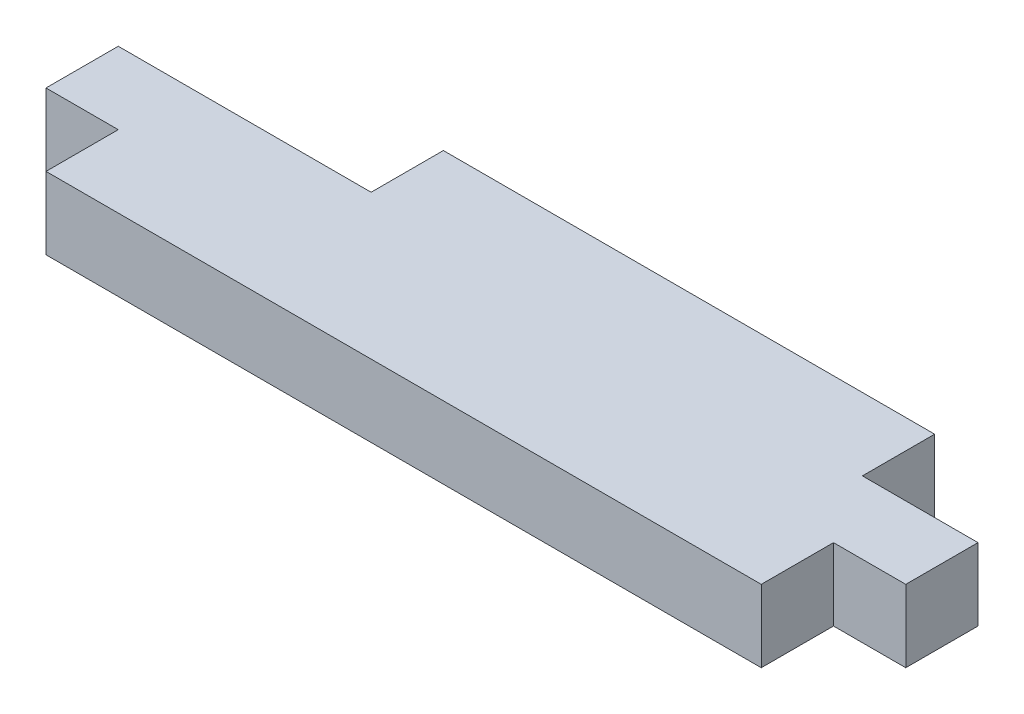
ISO-10303-21;
HEADER;
FILE_DESCRIPTION(('STEP AP214'),'2;1');
FILE_NAME('part.step','',(''),(''),'','','');
FILE_SCHEMA(('AUTOMOTIVE_DESIGN { 1 0 10303 214 1 1 1 1 }'));
ENDSEC;
DATA;
#1=APPLICATION_CONTEXT('core data for automotive mechanical design processes');
#2=APPLICATION_PROTOCOL_DEFINITION('international standard','automotive_design',2000,#1);
#3=PRODUCT_CONTEXT('',#1,'mechanical');
#4=PRODUCT('Part','Part','',(#3));
#5=PRODUCT_RELATED_PRODUCT_CATEGORY('part','',(#4));
#6=PRODUCT_DEFINITION_FORMATION('','',#4);
#7=PRODUCT_DEFINITION_CONTEXT('part definition',#1,'design');
#8=PRODUCT_DEFINITION('design','',#6,#7);
#9=PRODUCT_DEFINITION_SHAPE('','',#8);
#10=(LENGTH_UNIT() NAMED_UNIT(*) SI_UNIT(.MILLI.,.METRE.));
#11=(NAMED_UNIT(*) PLANE_ANGLE_UNIT() SI_UNIT($,.RADIAN.));
#12=(NAMED_UNIT(*) SI_UNIT($,.STERADIAN.) SOLID_ANGLE_UNIT());
#13=UNCERTAINTY_MEASURE_WITH_UNIT(LENGTH_MEASURE(1.E-05),#10,'distance_accuracy_value','');
#14=(GEOMETRIC_REPRESENTATION_CONTEXT(3) GLOBAL_UNCERTAINTY_ASSIGNED_CONTEXT((#13)) GLOBAL_UNIT_ASSIGNED_CONTEXT((#10,
#11,#12)) REPRESENTATION_CONTEXT('',''));
#15=CARTESIAN_POINT('',(0.,0.,0.));
#16=DIRECTION('',(0.,0.,1.));
#17=DIRECTION('',(1.,0.,0.));
#18=AXIS2_PLACEMENT_3D('',#15,#16,#17);
#19=CARTESIAN_POINT('',(0.,0.,0.));
#20=DIRECTION('',(0.,0.,-1.));
#21=DIRECTION('',(-1.,0.,0.));
#22=AXIS2_PLACEMENT_3D('',#19,#20,#21);
#23=PLANE('',#22);
#24=DIRECTION('',(0.,1.,0.));
#25=VECTOR('',#24,1.);
#26=CARTESIAN_POINT('',(46.3940421663746,-126.,0.));
#27=LINE('',#26,#25);
#28=CARTESIAN_POINT('',(46.3940421663746,-126.,0.));
#29=VERTEX_POINT('',#28);
#30=CARTESIAN_POINT('',(46.3940421663746,-121.,0.));
#31=VERTEX_POINT('',#30);
#32=EDGE_CURVE('E142',#29,#31,#27,.T.);
#33=ORIENTED_EDGE('',*,*,#32,.F.);
#34=DIRECTION('',(1.,0.,0.));
#35=VECTOR('',#34,1.);
#36=CARTESIAN_POINT('',(88.3940421663747,-126.,0.));
#37=LINE('',#36,#35);
#38=CARTESIAN_POINT('',(28.8940421663747,-126.,0.));
#39=VERTEX_POINT('',#38);
#40=EDGE_CURVE('E180',#39,#29,#37,.T.);
#41=ORIENTED_EDGE('',*,*,#40,.F.);
#42=DIRECTION('',(0.,-1.,0.));
#43=VECTOR('',#42,1.);
#44=CARTESIAN_POINT('',(28.8940421663747,-121.,0.));
#45=LINE('',#44,#43);
#46=CARTESIAN_POINT('',(28.8940421663747,-121.,0.));
#47=VERTEX_POINT('',#46);
#48=EDGE_CURVE('E193',#47,#39,#45,.T.);
#49=ORIENTED_EDGE('',*,*,#48,.F.);
#50=DIRECTION('',(-1.,0.,0.));
#51=VECTOR('',#50,1.);
#52=CARTESIAN_POINT('',(88.3940421663747,-121.,0.));
#53=LINE('',#52,#51);
#54=EDGE_CURVE('E47',#31,#47,#53,.T.);
#55=ORIENTED_EDGE('',*,*,#54,.F.);
#56=EDGE_LOOP('',(#33,#41,#49,#55));
#57=FACE_BOUND('',#56,.T.);
#58=ADVANCED_FACE('F32',(#57),#23,.T.);
#59=CARTESIAN_POINT('',(0.,0.,5.));
#60=DIRECTION('',(0.,0.,-1.));
#61=DIRECTION('',(-1.,0.,0.));
#62=AXIS2_PLACEMENT_3D('',#59,#60,#61);
#63=PLANE('',#62);
#64=DIRECTION('',(0.,-1.,0.));
#65=VECTOR('',#64,1.);
#66=CARTESIAN_POINT('',(33.8940421663747,-121.,5.));
#67=LINE('',#66,#65);
#68=CARTESIAN_POINT('',(33.8940421663747,-121.,5.));
#69=VERTEX_POINT('',#68);
#70=CARTESIAN_POINT('',(33.8940421663747,-126.,5.));
#71=VERTEX_POINT('',#70);
#72=EDGE_CURVE('E143',#69,#71,#67,.T.);
#73=ORIENTED_EDGE('',*,*,#72,.F.);
#74=DIRECTION('',(-1.,0.,0.));
#75=VECTOR('',#74,1.);
#76=CARTESIAN_POINT('',(88.3940421663747,-121.,5.));
#77=LINE('',#76,#75);
#78=CARTESIAN_POINT('',(28.8940421663747,-121.,5.));
#79=VERTEX_POINT('',#78);
#80=EDGE_CURVE('E179',#69,#79,#77,.T.);
#81=ORIENTED_EDGE('',*,*,#80,.T.);
#82=DIRECTION('',(0.,-1.,0.));
#83=VECTOR('',#82,1.);
#84=CARTESIAN_POINT('',(28.8940421663747,-121.,5.));
#85=LINE('',#84,#83);
#86=CARTESIAN_POINT('',(28.8940421663747,-126.,5.));
#87=VERTEX_POINT('',#86);
#88=EDGE_CURVE('E183',#79,#87,#85,.T.);
#89=ORIENTED_EDGE('',*,*,#88,.T.);
#90=DIRECTION('',(1.,0.,0.));
#91=VECTOR('',#90,1.);
#92=CARTESIAN_POINT('',(88.3940421663747,-126.,5.));
#93=LINE('',#92,#91);
#94=EDGE_CURVE('E186',#87,#71,#93,.T.);
#95=ORIENTED_EDGE('',*,*,#94,.T.);
#96=EDGE_LOOP('',(#73,#81,#89,#95));
#97=FACE_BOUND('',#96,.T.);
#98=ADVANCED_FACE('F246',(#97),#63,.F.);
#99=DIRECTION('',(0.,1.,0.));
#100=VECTOR('',#99,1.);
#101=CARTESIAN_POINT('',(83.3940421663746,-121.,5.));
#102=LINE('',#101,#100);
#103=CARTESIAN_POINT('',(83.3940421663746,-126.,5.));
#104=VERTEX_POINT('',#103);
#105=CARTESIAN_POINT('',(83.3940421663746,-121.,5.));
#106=VERTEX_POINT('',#105);
#107=EDGE_CURVE('E146',#104,#106,#102,.T.);
#108=ORIENTED_EDGE('',*,*,#107,.F.);
#109=CARTESIAN_POINT('',(88.3940421663747,-126.,5.));
#110=VERTEX_POINT('',#109);
#111=EDGE_CURVE('E185',#104,#110,#93,.T.);
#112=ORIENTED_EDGE('',*,*,#111,.T.);
#113=DIRECTION('',(0.,1.,0.));
#114=VECTOR('',#113,1.);
#115=CARTESIAN_POINT('',(88.3940421663747,-121.,5.));
#116=LINE('',#115,#114);
#117=CARTESIAN_POINT('',(88.3940421663747,-121.,5.));
#118=VERTEX_POINT('',#117);
#119=EDGE_CURVE('E176',#110,#118,#116,.T.);
#120=ORIENTED_EDGE('',*,*,#119,.T.);
#121=EDGE_CURVE('E181',#118,#106,#77,.T.);
#122=ORIENTED_EDGE('',*,*,#121,.T.);
#123=EDGE_LOOP('',(#108,#112,#120,#122));
#124=FACE_BOUND('',#123,.T.);
#125=ADVANCED_FACE('F233',(#124),#63,.F.);
#126=CARTESIAN_POINT('',(88.3940421663747,-121.,5.));
#127=DIRECTION('',(-1.,0.,0.));
#128=DIRECTION('',(0.,0.,1.));
#129=AXIS2_PLACEMENT_3D('',#126,#127,#128);
#130=PLANE('',#129);
#131=DIRECTION('',(0.,1.,0.));
#132=VECTOR('',#131,1.);
#133=CARTESIAN_POINT('',(88.3940421663747,-121.,0.));
#134=LINE('',#133,#132);
#135=CARTESIAN_POINT('',(88.3940421663747,-126.,0.));
#136=VERTEX_POINT('',#135);
#137=CARTESIAN_POINT('',(88.3940421663747,-121.,0.));
#138=VERTEX_POINT('',#137);
#139=EDGE_CURVE('E175',#136,#138,#134,.T.);
#140=ORIENTED_EDGE('',*,*,#139,.T.);
#141=DIRECTION('',(0.,0.,-1.));
#142=VECTOR('',#141,1.);
#143=CARTESIAN_POINT('',(88.3940421663747,-121.,5.));
#144=LINE('',#143,#142);
#145=EDGE_CURVE('E11',#118,#138,#144,.T.);
#146=ORIENTED_EDGE('',*,*,#145,.F.);
#147=ORIENTED_EDGE('',*,*,#119,.F.);
#148=DIRECTION('',(0.,0.,-1.));
#149=VECTOR('',#148,1.);
#150=CARTESIAN_POINT('',(88.3940421663747,-126.,5.));
#151=LINE('',#150,#149);
#152=EDGE_CURVE('E188',#110,#136,#151,.T.);
#153=ORIENTED_EDGE('',*,*,#152,.T.);
#154=EDGE_LOOP('',(#140,#146,#147,#153));
#155=FACE_BOUND('',#154,.T.);
#156=ADVANCED_FACE('F34',(#155),#130,.F.);
#157=CARTESIAN_POINT('',(88.3940421663747,-121.,5.));
#158=DIRECTION('',(0.,-1.,0.));
#159=DIRECTION('',(0.,0.,-1.));
#160=AXIS2_PLACEMENT_3D('',#157,#158,#159);
#161=PLANE('',#160);
#162=CARTESIAN_POINT('',(80.3940421663746,-121.,0.));
#163=VERTEX_POINT('',#162);
#164=EDGE_CURVE('E191',#138,#163,#53,.T.);
#165=ORIENTED_EDGE('',*,*,#164,.T.);
#166=DIRECTION('',(0.,0.,1.));
#167=VECTOR('',#166,1.);
#168=CARTESIAN_POINT('',(80.3940421663746,-121.,-5.));
#169=LINE('',#168,#167);
#170=CARTESIAN_POINT('',(80.3940421663746,-121.,-5.));
#171=VERTEX_POINT('',#170);
#172=EDGE_CURVE('E127',#171,#163,#169,.T.);
#173=ORIENTED_EDGE('',*,*,#172,.F.);
#174=DIRECTION('',(1.,0.,0.));
#175=VECTOR('',#174,1.);
#176=CARTESIAN_POINT('',(46.3940421663746,-121.,-5.));
#177=LINE('',#176,#175);
#178=CARTESIAN_POINT('',(46.3940421663746,-121.,-5.));
#179=VERTEX_POINT('',#178);
#180=EDGE_CURVE('E120',#179,#171,#177,.T.);
#181=ORIENTED_EDGE('',*,*,#180,.F.);
#182=DIRECTION('',(0.,0.,1.));
#183=VECTOR('',#182,1.);
#184=CARTESIAN_POINT('',(46.3940421663746,-121.,-5.));
#185=LINE('',#184,#183);
#186=EDGE_CURVE('E124',#179,#31,#185,.T.);
#187=ORIENTED_EDGE('',*,*,#186,.T.);
#188=ORIENTED_EDGE('',*,*,#54,.T.);
#189=DIRECTION('',(0.,0.,-1.));
#190=VECTOR('',#189,1.);
#191=CARTESIAN_POINT('',(28.8940421663747,-121.,5.));
#192=LINE('',#191,#190);
#193=EDGE_CURVE('E40',#79,#47,#192,.T.);
#194=ORIENTED_EDGE('',*,*,#193,.F.);
#195=ORIENTED_EDGE('',*,*,#80,.F.);
#196=DIRECTION('',(0.,0.,-1.));
#197=VECTOR('',#196,1.);
#198=CARTESIAN_POINT('',(33.8940421663747,-121.,10.));
#199=LINE('',#198,#197);
#200=CARTESIAN_POINT('',(33.8940421663747,-121.,10.));
#201=VERTEX_POINT('',#200);
#202=EDGE_CURVE('E160',#201,#69,#199,.T.);
#203=ORIENTED_EDGE('',*,*,#202,.F.);
#204=DIRECTION('',(-1.,0.,0.));
#205=VECTOR('',#204,1.);
#206=CARTESIAN_POINT('',(33.8940421663747,-121.,10.));
#207=LINE('',#206,#205);
#208=CARTESIAN_POINT('',(83.3940421663746,-121.,10.));
#209=VERTEX_POINT('',#208);
#210=EDGE_CURVE('E159',#209,#201,#207,.T.);
#211=ORIENTED_EDGE('',*,*,#210,.F.);
#212=DIRECTION('',(0.,0.,-1.));
#213=VECTOR('',#212,1.);
#214=CARTESIAN_POINT('',(83.3940421663746,-121.,10.));
#215=LINE('',#214,#213);
#216=EDGE_CURVE('E166',#209,#106,#215,.T.);
#217=ORIENTED_EDGE('',*,*,#216,.T.);
#218=ORIENTED_EDGE('',*,*,#121,.F.);
#219=ORIENTED_EDGE('',*,*,#145,.T.);
#220=EDGE_LOOP('',(#165,#173,#181,#187,#188,#194,#195,#203,#211,#217,#218,#219));
#221=FACE_BOUND('',#220,.T.);
#222=ADVANCED_FACE('F122',(#221),#161,.F.);
#223=CARTESIAN_POINT('',(28.8940421663747,-121.,5.));
#224=DIRECTION('',(1.,0.,0.));
#225=DIRECTION('',(0.,0.,-1.));
#226=AXIS2_PLACEMENT_3D('',#223,#224,#225);
#227=PLANE('',#226);
#228=ORIENTED_EDGE('',*,*,#48,.T.);
#229=DIRECTION('',(0.,0.,-1.));
#230=VECTOR('',#229,1.);
#231=CARTESIAN_POINT('',(28.8940421663747,-126.,5.));
#232=LINE('',#231,#230);
#233=EDGE_CURVE('E200',#87,#39,#232,.T.);
#234=ORIENTED_EDGE('',*,*,#233,.F.);
#235=ORIENTED_EDGE('',*,*,#88,.F.);
#236=ORIENTED_EDGE('',*,*,#193,.T.);
#237=EDGE_LOOP('',(#228,#234,#235,#236));
#238=FACE_BOUND('',#237,.T.);
#239=ADVANCED_FACE('F206',(#238),#227,.F.);
#240=CARTESIAN_POINT('',(88.3940421663747,-126.,5.));
#241=DIRECTION('',(0.,1.,0.));
#242=DIRECTION('',(0.,0.,1.));
#243=AXIS2_PLACEMENT_3D('',#240,#241,#242);
#244=PLANE('',#243);
#245=ORIENTED_EDGE('',*,*,#40,.T.);
#246=DIRECTION('',(0.,0.,1.));
#247=VECTOR('',#246,1.);
#248=CARTESIAN_POINT('',(46.3940421663746,-126.,-5.));
#249=LINE('',#248,#247);
#250=CARTESIAN_POINT('',(46.3940421663746,-126.,-5.));
#251=VERTEX_POINT('',#250);
#252=EDGE_CURVE('E212',#251,#29,#249,.T.);
#253=ORIENTED_EDGE('',*,*,#252,.F.);
#254=DIRECTION('',(-1.,0.,0.));
#255=VECTOR('',#254,1.);
#256=CARTESIAN_POINT('',(46.3940421663746,-126.,-5.));
#257=LINE('',#256,#255);
#258=CARTESIAN_POINT('',(80.3940421663746,-126.,-5.));
#259=VERTEX_POINT('',#258);
#260=EDGE_CURVE('E136',#259,#251,#257,.T.);
#261=ORIENTED_EDGE('',*,*,#260,.F.);
#262=DIRECTION('',(0.,0.,1.));
#263=VECTOR('',#262,1.);
#264=CARTESIAN_POINT('',(80.3940421663746,-126.,-5.));
#265=LINE('',#264,#263);
#266=CARTESIAN_POINT('',(80.3940421663746,-126.,0.));
#267=VERTEX_POINT('',#266);
#268=EDGE_CURVE('E148',#259,#267,#265,.T.);
#269=ORIENTED_EDGE('',*,*,#268,.T.);
#270=EDGE_CURVE('E195',#267,#136,#37,.T.);
#271=ORIENTED_EDGE('',*,*,#270,.T.);
#272=ORIENTED_EDGE('',*,*,#152,.F.);
#273=ORIENTED_EDGE('',*,*,#111,.F.);
#274=DIRECTION('',(0.,0.,-1.));
#275=VECTOR('',#274,1.);
#276=CARTESIAN_POINT('',(83.3940421663746,-126.,10.));
#277=LINE('',#276,#275);
#278=CARTESIAN_POINT('',(83.3940421663746,-126.,10.));
#279=VERTEX_POINT('',#278);
#280=EDGE_CURVE('E169',#279,#104,#277,.T.);
#281=ORIENTED_EDGE('',*,*,#280,.F.);
#282=DIRECTION('',(1.,0.,0.));
#283=VECTOR('',#282,1.);
#284=CARTESIAN_POINT('',(33.8940421663747,-126.,10.));
#285=LINE('',#284,#283);
#286=CARTESIAN_POINT('',(33.8940421663747,-126.,10.));
#287=VERTEX_POINT('',#286);
#288=EDGE_CURVE('E155',#287,#279,#285,.T.);
#289=ORIENTED_EDGE('',*,*,#288,.F.);
#290=DIRECTION('',(0.,0.,-1.));
#291=VECTOR('',#290,1.);
#292=CARTESIAN_POINT('',(33.8940421663747,-126.,10.));
#293=LINE('',#292,#291);
#294=EDGE_CURVE('E172',#287,#71,#293,.T.);
#295=ORIENTED_EDGE('',*,*,#294,.T.);
#296=ORIENTED_EDGE('',*,*,#94,.F.);
#297=ORIENTED_EDGE('',*,*,#233,.T.);
#298=EDGE_LOOP('',(#245,#253,#261,#269,#271,#272,#273,#281,#289,#295,#296,#297));
#299=FACE_BOUND('',#298,.T.);
#300=ADVANCED_FACE('F211',(#299),#244,.F.);
#301=DIRECTION('',(0.,-1.,0.));
#302=VECTOR('',#301,1.);
#303=CARTESIAN_POINT('',(80.3940421663746,-126.,0.));
#304=LINE('',#303,#302);
#305=EDGE_CURVE('E55',#163,#267,#304,.T.);
#306=ORIENTED_EDGE('',*,*,#305,.F.);
#307=ORIENTED_EDGE('',*,*,#164,.F.);
#308=ORIENTED_EDGE('',*,*,#139,.F.);
#309=ORIENTED_EDGE('',*,*,#270,.F.);
#310=EDGE_LOOP('',(#306,#307,#308,#309));
#311=FACE_BOUND('',#310,.T.);
#312=ADVANCED_FACE('F229',(#311),#23,.T.);
#313=CARTESIAN_POINT('',(33.8940421663747,-121.,10.));
#314=DIRECTION('',(1.,0.,0.));
#315=DIRECTION('',(0.,0.,-1.));
#316=AXIS2_PLACEMENT_3D('',#313,#314,#315);
#317=PLANE('',#316);
#318=ORIENTED_EDGE('',*,*,#72,.T.);
#319=ORIENTED_EDGE('',*,*,#294,.F.);
#320=DIRECTION('',(0.,-1.,0.));
#321=VECTOR('',#320,1.);
#322=CARTESIAN_POINT('',(33.8940421663747,-121.,10.));
#323=LINE('',#322,#321);
#324=EDGE_CURVE('E152',#201,#287,#323,.T.);
#325=ORIENTED_EDGE('',*,*,#324,.F.);
#326=ORIENTED_EDGE('',*,*,#202,.T.);
#327=EDGE_LOOP('',(#318,#319,#325,#326));
#328=FACE_BOUND('',#327,.T.);
#329=ADVANCED_FACE('F244',(#328),#317,.F.);
#330=CARTESIAN_POINT('',(83.3940421663746,-121.,10.));
#331=DIRECTION('',(-1.,0.,0.));
#332=DIRECTION('',(0.,0.,1.));
#333=AXIS2_PLACEMENT_3D('',#330,#331,#332);
#334=PLANE('',#333);
#335=ORIENTED_EDGE('',*,*,#107,.T.);
#336=ORIENTED_EDGE('',*,*,#216,.F.);
#337=DIRECTION('',(0.,1.,0.));
#338=VECTOR('',#337,1.);
#339=CARTESIAN_POINT('',(83.3940421663746,-121.,10.));
#340=LINE('',#339,#338);
#341=EDGE_CURVE('E157',#279,#209,#340,.T.);
#342=ORIENTED_EDGE('',*,*,#341,.F.);
#343=ORIENTED_EDGE('',*,*,#280,.T.);
#344=EDGE_LOOP('',(#335,#336,#342,#343));
#345=FACE_BOUND('',#344,.T.);
#346=ADVANCED_FACE('F237',(#345),#334,.F.);
#347=CARTESIAN_POINT('',(0.,0.,10.));
#348=DIRECTION('',(0.,0.,1.));
#349=DIRECTION('',(1.,0.,0.));
#350=AXIS2_PLACEMENT_3D('',#347,#348,#349);
#351=PLANE('',#350);
#352=ORIENTED_EDGE('',*,*,#324,.T.);
#353=ORIENTED_EDGE('',*,*,#288,.T.);
#354=ORIENTED_EDGE('',*,*,#341,.T.);
#355=ORIENTED_EDGE('',*,*,#210,.T.);
#356=EDGE_LOOP('',(#352,#353,#354,#355));
#357=FACE_BOUND('',#356,.T.);
#358=ADVANCED_FACE('F239',(#357),#351,.T.);
#359=CARTESIAN_POINT('',(46.3940421663746,-126.,-5.));
#360=DIRECTION('',(1.,0.,0.));
#361=DIRECTION('',(0.,0.,-1.));
#362=AXIS2_PLACEMENT_3D('',#359,#360,#361);
#363=PLANE('',#362);
#364=ORIENTED_EDGE('',*,*,#32,.T.);
#365=ORIENTED_EDGE('',*,*,#186,.F.);
#366=DIRECTION('',(0.,1.,0.));
#367=VECTOR('',#366,1.);
#368=CARTESIAN_POINT('',(46.3940421663746,-126.,-5.));
#369=LINE('',#368,#367);
#370=EDGE_CURVE('E131',#251,#179,#369,.T.);
#371=ORIENTED_EDGE('',*,*,#370,.F.);
#372=ORIENTED_EDGE('',*,*,#252,.T.);
#373=EDGE_LOOP('',(#364,#365,#371,#372));
#374=FACE_BOUND('',#373,.T.);
#375=ADVANCED_FACE('F141',(#374),#363,.F.);
#376=CARTESIAN_POINT('',(80.3940421663746,-126.,-5.));
#377=DIRECTION('',(-1.,0.,0.));
#378=DIRECTION('',(0.,0.,1.));
#379=AXIS2_PLACEMENT_3D('',#376,#377,#378);
#380=PLANE('',#379);
#381=ORIENTED_EDGE('',*,*,#305,.T.);
#382=ORIENTED_EDGE('',*,*,#268,.F.);
#383=DIRECTION('',(0.,-1.,0.));
#384=VECTOR('',#383,1.);
#385=CARTESIAN_POINT('',(80.3940421663746,-126.,-5.));
#386=LINE('',#385,#384);
#387=EDGE_CURVE('E130',#171,#259,#386,.T.);
#388=ORIENTED_EDGE('',*,*,#387,.F.);
#389=ORIENTED_EDGE('',*,*,#172,.T.);
#390=EDGE_LOOP('',(#381,#382,#388,#389));
#391=FACE_BOUND('',#390,.T.);
#392=ADVANCED_FACE('F222',(#391),#380,.F.);
#393=CARTESIAN_POINT('',(0.,0.,-5.));
#394=DIRECTION('',(0.,0.,-1.));
#395=DIRECTION('',(-1.,0.,0.));
#396=AXIS2_PLACEMENT_3D('',#393,#394,#395);
#397=PLANE('',#396);
#398=ORIENTED_EDGE('',*,*,#370,.T.);
#399=ORIENTED_EDGE('',*,*,#180,.T.);
#400=ORIENTED_EDGE('',*,*,#387,.T.);
#401=ORIENTED_EDGE('',*,*,#260,.T.);
#402=EDGE_LOOP('',(#398,#399,#400,#401));
#403=FACE_BOUND('',#402,.T.);
#404=ADVANCED_FACE('F134',(#403),#397,.T.);
#405=CLOSED_SHELL('',(#58,#98,#125,#156,#222,#239,#300,#312,#329,#346,#358,#375,#392,#404));
#406=MANIFOLD_SOLID_BREP('B2',#405);
#407=ADVANCED_BREP_SHAPE_REPRESENTATION('',(#18,#406),#14);
#408=SHAPE_DEFINITION_REPRESENTATION(#9,#407);
ENDSEC;
END-ISO-10303-21;
